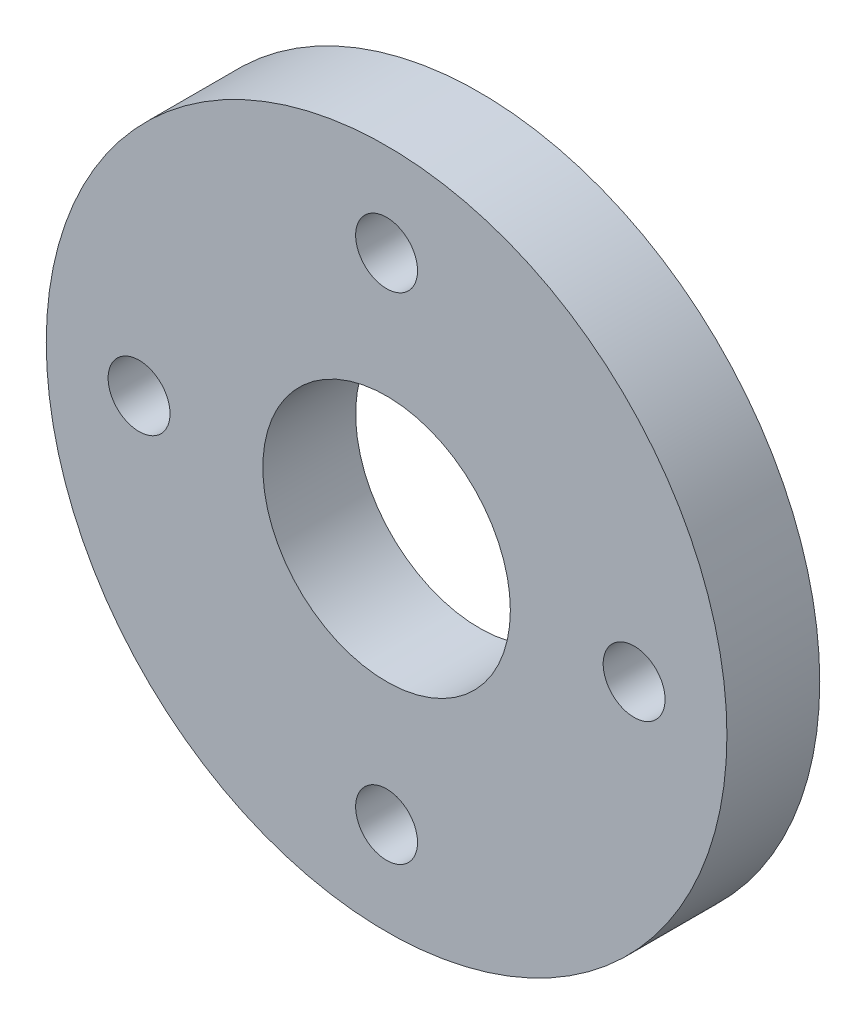
ISO-10303-21;
HEADER;
FILE_DESCRIPTION(('STEP AP214'),'2;1');
FILE_NAME('part.step','',(''),(''),'','','');
FILE_SCHEMA(('AUTOMOTIVE_DESIGN { 1 0 10303 214 1 1 1 1 }'));
ENDSEC;
DATA;
#1=APPLICATION_CONTEXT('core data for automotive mechanical design processes');
#2=APPLICATION_PROTOCOL_DEFINITION('international standard','automotive_design',2000,#1);
#3=PRODUCT_CONTEXT('',#1,'mechanical');
#4=PRODUCT('Part','Part','',(#3));
#5=PRODUCT_RELATED_PRODUCT_CATEGORY('part','',(#4));
#6=PRODUCT_DEFINITION_FORMATION('','',#4);
#7=PRODUCT_DEFINITION_CONTEXT('part definition',#1,'design');
#8=PRODUCT_DEFINITION('design','',#6,#7);
#9=PRODUCT_DEFINITION_SHAPE('','',#8);
#10=(LENGTH_UNIT() NAMED_UNIT(*) SI_UNIT(.MILLI.,.METRE.));
#11=(NAMED_UNIT(*) PLANE_ANGLE_UNIT() SI_UNIT($,.RADIAN.));
#12=(NAMED_UNIT(*) SI_UNIT($,.STERADIAN.) SOLID_ANGLE_UNIT());
#13=UNCERTAINTY_MEASURE_WITH_UNIT(LENGTH_MEASURE(1.E-05),#10,'distance_accuracy_value','');
#14=(GEOMETRIC_REPRESENTATION_CONTEXT(3) GLOBAL_UNCERTAINTY_ASSIGNED_CONTEXT((#13)) GLOBAL_UNIT_ASSIGNED_CONTEXT((#10,
#11,#12)) REPRESENTATION_CONTEXT('',''));
#15=CARTESIAN_POINT('',(0.,0.,0.));
#16=DIRECTION('',(0.,0.,1.));
#17=DIRECTION('',(1.,0.,0.));
#18=AXIS2_PLACEMENT_3D('',#15,#16,#17);
#19=CARTESIAN_POINT('',(0.,0.,3.));
#20=DIRECTION('',(0.,0.,-1.));
#21=DIRECTION('',(-1.,0.,0.));
#22=AXIS2_PLACEMENT_3D('',#19,#20,#21);
#23=CYLINDRICAL_SURFACE('',#22,11.);
#24=CARTESIAN_POINT('',(0.,0.,3.));
#25=DIRECTION('',(0.,0.,1.));
#26=DIRECTION('',(1.,0.,0.));
#27=AXIS2_PLACEMENT_3D('',#24,#25,#26);
#28=CIRCLE('',#27,11.);
#29=CARTESIAN_POINT('',(11.,0.,3.));
#30=VERTEX_POINT('',#29);
#31=EDGE_CURVE('E10',#30,#30,#28,.T.);
#32=ORIENTED_EDGE('',*,*,#31,.F.);
#33=EDGE_LOOP('',(#32));
#34=FACE_BOUND('',#33,.T.);
#35=CARTESIAN_POINT('',(0.,0.,0.));
#36=DIRECTION('',(0.,0.,1.));
#37=DIRECTION('',(1.,0.,0.));
#38=AXIS2_PLACEMENT_3D('',#35,#36,#37);
#39=CIRCLE('',#38,11.);
#40=CARTESIAN_POINT('',(11.,0.,0.));
#41=VERTEX_POINT('',#40);
#42=EDGE_CURVE('E35',#41,#41,#39,.T.);
#43=ORIENTED_EDGE('',*,*,#42,.T.);
#44=EDGE_LOOP('',(#43));
#45=FACE_BOUND('',#44,.T.);
#46=ADVANCED_FACE('F32',(#34,#45),#23,.T.);
#47=CARTESIAN_POINT('',(0.,0.,3.));
#48=DIRECTION('',(0.,0.,1.));
#49=DIRECTION('',(1.,0.,0.));
#50=AXIS2_PLACEMENT_3D('',#47,#48,#49);
#51=PLANE('',#50);
#52=CARTESIAN_POINT('',(-8.,0.,3.));
#53=DIRECTION('',(0.,0.,1.));
#54=DIRECTION('',(1.,0.,0.));
#55=AXIS2_PLACEMENT_3D('',#52,#53,#54);
#56=CIRCLE('',#55,1.);
#57=CARTESIAN_POINT('',(-7.,0.,3.));
#58=VERTEX_POINT('',#57);
#59=EDGE_CURVE('E68',#58,#58,#56,.T.);
#60=ORIENTED_EDGE('',*,*,#59,.F.);
#61=EDGE_LOOP('',(#60));
#62=FACE_BOUND('',#61,.T.);
#63=CARTESIAN_POINT('',(8.,0.,3.));
#64=DIRECTION('',(0.,0.,1.));
#65=DIRECTION('',(1.,0.,0.));
#66=AXIS2_PLACEMENT_3D('',#63,#64,#65);
#67=CIRCLE('',#66,1.);
#68=CARTESIAN_POINT('',(9.,0.,3.));
#69=VERTEX_POINT('',#68);
#70=EDGE_CURVE('E62',#69,#69,#67,.T.);
#71=ORIENTED_EDGE('',*,*,#70,.F.);
#72=EDGE_LOOP('',(#71));
#73=FACE_BOUND('',#72,.T.);
#74=CARTESIAN_POINT('',(0.,-8.,3.));
#75=DIRECTION('',(0.,0.,1.));
#76=DIRECTION('',(1.,0.,0.));
#77=AXIS2_PLACEMENT_3D('',#74,#75,#76);
#78=CIRCLE('',#77,1.);
#79=CARTESIAN_POINT('',(1.,-8.,3.));
#80=VERTEX_POINT('',#79);
#81=EDGE_CURVE('E56',#80,#80,#78,.T.);
#82=ORIENTED_EDGE('',*,*,#81,.F.);
#83=EDGE_LOOP('',(#82));
#84=FACE_BOUND('',#83,.T.);
#85=CARTESIAN_POINT('',(0.,8.,3.));
#86=DIRECTION('',(0.,0.,1.));
#87=DIRECTION('',(1.,0.,0.));
#88=AXIS2_PLACEMENT_3D('',#85,#86,#87);
#89=CIRCLE('',#88,1.);
#90=CARTESIAN_POINT('',(1.,8.,3.));
#91=VERTEX_POINT('',#90);
#92=EDGE_CURVE('E50',#91,#91,#89,.T.);
#93=ORIENTED_EDGE('',*,*,#92,.F.);
#94=EDGE_LOOP('',(#93));
#95=FACE_BOUND('',#94,.T.);
#96=CARTESIAN_POINT('',(0.,0.,3.));
#97=DIRECTION('',(0.,0.,1.));
#98=DIRECTION('',(1.,0.,0.));
#99=AXIS2_PLACEMENT_3D('',#96,#97,#98);
#100=CIRCLE('',#99,4.);
#101=CARTESIAN_POINT('',(4.,0.,3.));
#102=VERTEX_POINT('',#101);
#103=EDGE_CURVE('E44',#102,#102,#100,.T.);
#104=ORIENTED_EDGE('',*,*,#103,.F.);
#105=EDGE_LOOP('',(#104));
#106=FACE_BOUND('',#105,.T.);
#107=ORIENTED_EDGE('',*,*,#31,.T.);
#108=EDGE_LOOP('',(#107));
#109=FACE_BOUND('',#108,.T.);
#110=ADVANCED_FACE('F84',(#62,#73,#84,#95,#106,#109),#51,.T.);
#111=CARTESIAN_POINT('',(0.,0.,0.));
#112=DIRECTION('',(0.,0.,1.));
#113=DIRECTION('',(1.,0.,0.));
#114=AXIS2_PLACEMENT_3D('',#111,#112,#113);
#115=PLANE('',#114);
#116=CARTESIAN_POINT('',(-8.,0.,0.));
#117=DIRECTION('',(0.,0.,1.));
#118=DIRECTION('',(1.,0.,0.));
#119=AXIS2_PLACEMENT_3D('',#116,#117,#118);
#120=CIRCLE('',#119,1.);
#121=CARTESIAN_POINT('',(-7.,0.,0.));
#122=VERTEX_POINT('',#121);
#123=EDGE_CURVE('E65',#122,#122,#120,.T.);
#124=ORIENTED_EDGE('',*,*,#123,.T.);
#125=EDGE_LOOP('',(#124));
#126=FACE_BOUND('',#125,.T.);
#127=CARTESIAN_POINT('',(8.,0.,0.));
#128=DIRECTION('',(0.,0.,1.));
#129=DIRECTION('',(1.,0.,0.));
#130=AXIS2_PLACEMENT_3D('',#127,#128,#129);
#131=CIRCLE('',#130,1.);
#132=CARTESIAN_POINT('',(9.,0.,0.));
#133=VERTEX_POINT('',#132);
#134=EDGE_CURVE('E59',#133,#133,#131,.T.);
#135=ORIENTED_EDGE('',*,*,#134,.T.);
#136=EDGE_LOOP('',(#135));
#137=FACE_BOUND('',#136,.T.);
#138=CARTESIAN_POINT('',(0.,-8.,0.));
#139=DIRECTION('',(0.,0.,1.));
#140=DIRECTION('',(1.,0.,0.));
#141=AXIS2_PLACEMENT_3D('',#138,#139,#140);
#142=CIRCLE('',#141,1.);
#143=CARTESIAN_POINT('',(1.,-8.,0.));
#144=VERTEX_POINT('',#143);
#145=EDGE_CURVE('E53',#144,#144,#142,.T.);
#146=ORIENTED_EDGE('',*,*,#145,.T.);
#147=EDGE_LOOP('',(#146));
#148=FACE_BOUND('',#147,.T.);
#149=CARTESIAN_POINT('',(0.,8.,0.));
#150=DIRECTION('',(0.,0.,1.));
#151=DIRECTION('',(1.,0.,0.));
#152=AXIS2_PLACEMENT_3D('',#149,#150,#151);
#153=CIRCLE('',#152,1.);
#154=CARTESIAN_POINT('',(1.,8.,0.));
#155=VERTEX_POINT('',#154);
#156=EDGE_CURVE('E47',#155,#155,#153,.T.);
#157=ORIENTED_EDGE('',*,*,#156,.T.);
#158=EDGE_LOOP('',(#157));
#159=FACE_BOUND('',#158,.T.);
#160=CARTESIAN_POINT('',(0.,0.,0.));
#161=DIRECTION('',(0.,0.,1.));
#162=DIRECTION('',(1.,0.,0.));
#163=AXIS2_PLACEMENT_3D('',#160,#161,#162);
#164=CIRCLE('',#163,4.);
#165=CARTESIAN_POINT('',(4.,0.,0.));
#166=VERTEX_POINT('',#165);
#167=EDGE_CURVE('E42',#166,#166,#164,.T.);
#168=ORIENTED_EDGE('',*,*,#167,.T.);
#169=EDGE_LOOP('',(#168));
#170=FACE_BOUND('',#169,.T.);
#171=ORIENTED_EDGE('',*,*,#42,.F.);
#172=EDGE_LOOP('',(#171));
#173=FACE_BOUND('',#172,.T.);
#174=ADVANCED_FACE('F74',(#126,#137,#148,#159,#170,#173),#115,.F.);
#175=CARTESIAN_POINT('',(0.,0.,0.));
#176=DIRECTION('',(0.,0.,1.));
#177=DIRECTION('',(1.,0.,0.));
#178=AXIS2_PLACEMENT_3D('',#175,#176,#177);
#179=CYLINDRICAL_SURFACE('',#178,4.);
#180=ORIENTED_EDGE('',*,*,#167,.F.);
#181=EDGE_LOOP('',(#180));
#182=FACE_BOUND('',#181,.T.);
#183=ORIENTED_EDGE('',*,*,#103,.T.);
#184=EDGE_LOOP('',(#183));
#185=FACE_BOUND('',#184,.T.);
#186=ADVANCED_FACE('F96',(#182,#185),#179,.F.);
#187=CARTESIAN_POINT('',(0.,8.,0.));
#188=DIRECTION('',(0.,0.,1.));
#189=DIRECTION('',(1.,0.,0.));
#190=AXIS2_PLACEMENT_3D('',#187,#188,#189);
#191=CYLINDRICAL_SURFACE('',#190,1.);
#192=ORIENTED_EDGE('',*,*,#156,.F.);
#193=EDGE_LOOP('',(#192));
#194=FACE_BOUND('',#193,.T.);
#195=ORIENTED_EDGE('',*,*,#92,.T.);
#196=EDGE_LOOP('',(#195));
#197=FACE_BOUND('',#196,.T.);
#198=ADVANCED_FACE('F98',(#194,#197),#191,.F.);
#199=CARTESIAN_POINT('',(0.,-8.,0.));
#200=DIRECTION('',(0.,0.,1.));
#201=DIRECTION('',(1.,0.,0.));
#202=AXIS2_PLACEMENT_3D('',#199,#200,#201);
#203=CYLINDRICAL_SURFACE('',#202,1.);
#204=ORIENTED_EDGE('',*,*,#145,.F.);
#205=EDGE_LOOP('',(#204));
#206=FACE_BOUND('',#205,.T.);
#207=ORIENTED_EDGE('',*,*,#81,.T.);
#208=EDGE_LOOP('',(#207));
#209=FACE_BOUND('',#208,.T.);
#210=ADVANCED_FACE('F105',(#206,#209),#203,.F.);
#211=CARTESIAN_POINT('',(8.,0.,0.));
#212=DIRECTION('',(0.,0.,1.));
#213=DIRECTION('',(1.,0.,0.));
#214=AXIS2_PLACEMENT_3D('',#211,#212,#213);
#215=CYLINDRICAL_SURFACE('',#214,1.);
#216=ORIENTED_EDGE('',*,*,#134,.F.);
#217=EDGE_LOOP('',(#216));
#218=FACE_BOUND('',#217,.T.);
#219=ORIENTED_EDGE('',*,*,#70,.T.);
#220=EDGE_LOOP('',(#219));
#221=FACE_BOUND('',#220,.T.);
#222=ADVANCED_FACE('F80',(#218,#221),#215,.F.);
#223=CARTESIAN_POINT('',(-8.,0.,0.));
#224=DIRECTION('',(0.,0.,1.));
#225=DIRECTION('',(1.,0.,0.));
#226=AXIS2_PLACEMENT_3D('',#223,#224,#225);
#227=CYLINDRICAL_SURFACE('',#226,1.);
#228=ORIENTED_EDGE('',*,*,#123,.F.);
#229=EDGE_LOOP('',(#228));
#230=FACE_BOUND('',#229,.T.);
#231=ORIENTED_EDGE('',*,*,#59,.T.);
#232=EDGE_LOOP('',(#231));
#233=FACE_BOUND('',#232,.T.);
#234=ADVANCED_FACE('F77',(#230,#233),#227,.F.);
#235=CLOSED_SHELL('',(#46,#110,#174,#186,#198,#210,#222,#234));
#236=MANIFOLD_SOLID_BREP('B2',#235);
#237=ADVANCED_BREP_SHAPE_REPRESENTATION('',(#18,#236),#14);
#238=SHAPE_DEFINITION_REPRESENTATION(#9,#237);
ENDSEC;
END-ISO-10303-21;
